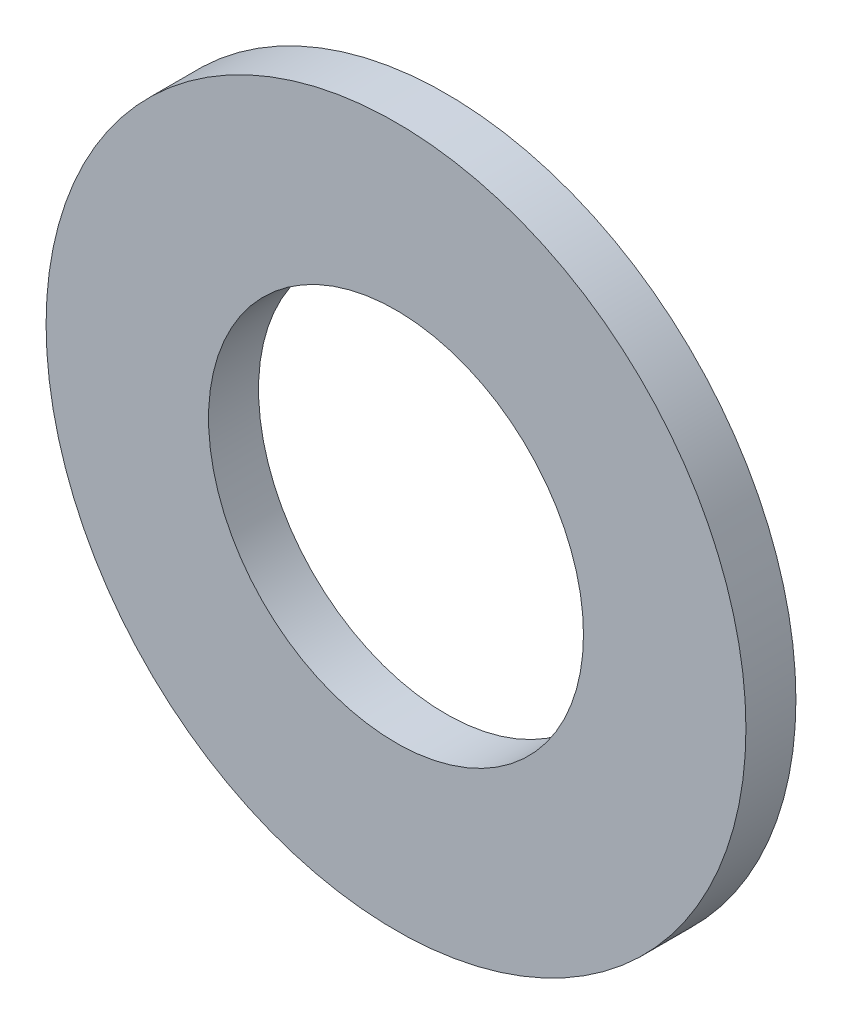
ISO-10303-21;
HEADER;
FILE_DESCRIPTION(('STEP AP214'),'2;1');
FILE_NAME('part.step','',(''),(''),'','','');
FILE_SCHEMA(('AUTOMOTIVE_DESIGN { 1 0 10303 214 1 1 1 1 }'));
ENDSEC;
DATA;
#1=APPLICATION_CONTEXT('core data for automotive mechanical design processes');
#2=APPLICATION_PROTOCOL_DEFINITION('international standard','automotive_design',2000,#1);
#3=PRODUCT_CONTEXT('',#1,'mechanical');
#4=PRODUCT('Part','Part','',(#3));
#5=PRODUCT_RELATED_PRODUCT_CATEGORY('part','',(#4));
#6=PRODUCT_DEFINITION_FORMATION('','',#4);
#7=PRODUCT_DEFINITION_CONTEXT('part definition',#1,'design');
#8=PRODUCT_DEFINITION('design','',#6,#7);
#9=PRODUCT_DEFINITION_SHAPE('','',#8);
#10=(LENGTH_UNIT() NAMED_UNIT(*) SI_UNIT(.MILLI.,.METRE.));
#11=(NAMED_UNIT(*) PLANE_ANGLE_UNIT() SI_UNIT($,.RADIAN.));
#12=(NAMED_UNIT(*) SI_UNIT($,.STERADIAN.) SOLID_ANGLE_UNIT());
#13=UNCERTAINTY_MEASURE_WITH_UNIT(LENGTH_MEASURE(1.E-05),#10,'distance_accuracy_value','');
#14=(GEOMETRIC_REPRESENTATION_CONTEXT(3) GLOBAL_UNCERTAINTY_ASSIGNED_CONTEXT((#13)) GLOBAL_UNIT_ASSIGNED_CONTEXT((#10,
#11,#12)) REPRESENTATION_CONTEXT('',''));
#15=CARTESIAN_POINT('',(0.,0.,0.));
#16=DIRECTION('',(0.,0.,1.));
#17=DIRECTION('',(1.,0.,0.));
#18=AXIS2_PLACEMENT_3D('',#15,#16,#17);
#19=CARTESIAN_POINT('',(0.,0.,2.));
#20=DIRECTION('',(0.,0.,1.));
#21=DIRECTION('',(1.,0.,0.));
#22=AXIS2_PLACEMENT_3D('',#19,#20,#21);
#23=PLANE('',#22);
#24=CARTESIAN_POINT('',(0.,0.,2.));
#25=DIRECTION('',(0.,0.,1.));
#26=DIRECTION('',(1.,0.,0.));
#27=AXIS2_PLACEMENT_3D('',#24,#25,#26);
#28=CIRCLE('',#27,14.);
#29=CARTESIAN_POINT('',(14.,0.,2.));
#30=VERTEX_POINT('',#29);
#31=EDGE_CURVE('E10',#30,#30,#28,.T.);
#32=ORIENTED_EDGE('',*,*,#31,.T.);
#33=EDGE_LOOP('',(#32));
#34=FACE_BOUND('',#33,.T.);
#35=CARTESIAN_POINT('',(0.,0.,2.));
#36=DIRECTION('',(0.,0.,1.));
#37=DIRECTION('',(1.,0.,0.));
#38=AXIS2_PLACEMENT_3D('',#35,#36,#37);
#39=CIRCLE('',#38,7.5);
#40=CARTESIAN_POINT('',(7.5,0.,2.));
#41=VERTEX_POINT('',#40);
#42=EDGE_CURVE('E42',#41,#41,#39,.T.);
#43=ORIENTED_EDGE('',*,*,#42,.F.);
#44=EDGE_LOOP('',(#43));
#45=FACE_BOUND('',#44,.T.);
#46=ADVANCED_FACE('F31',(#34,#45),#23,.T.);
#47=CARTESIAN_POINT('',(0.,0.,0.));
#48=DIRECTION('',(0.,0.,1.));
#49=DIRECTION('',(1.,0.,0.));
#50=AXIS2_PLACEMENT_3D('',#47,#48,#49);
#51=PLANE('',#50);
#52=CARTESIAN_POINT('',(0.,0.,0.));
#53=DIRECTION('',(0.,0.,1.));
#54=DIRECTION('',(1.,0.,0.));
#55=AXIS2_PLACEMENT_3D('',#52,#53,#54);
#56=CIRCLE('',#55,14.);
#57=CARTESIAN_POINT('',(14.,0.,0.));
#58=VERTEX_POINT('',#57);
#59=EDGE_CURVE('E35',#58,#58,#56,.T.);
#60=ORIENTED_EDGE('',*,*,#59,.F.);
#61=EDGE_LOOP('',(#60));
#62=FACE_BOUND('',#61,.T.);
#63=CARTESIAN_POINT('',(0.,0.,0.));
#64=DIRECTION('',(0.,0.,1.));
#65=DIRECTION('',(1.,0.,0.));
#66=AXIS2_PLACEMENT_3D('',#63,#64,#65);
#67=CIRCLE('',#66,7.5);
#68=CARTESIAN_POINT('',(7.5,0.,0.));
#69=VERTEX_POINT('',#68);
#70=EDGE_CURVE('E44',#69,#69,#67,.T.);
#71=ORIENTED_EDGE('',*,*,#70,.T.);
#72=EDGE_LOOP('',(#71));
#73=FACE_BOUND('',#72,.T.);
#74=ADVANCED_FACE('F54',(#62,#73),#51,.F.);
#75=CARTESIAN_POINT('',(0.,0.,2.));
#76=DIRECTION('',(0.,0.,-1.));
#77=DIRECTION('',(-1.,0.,0.));
#78=AXIS2_PLACEMENT_3D('',#75,#76,#77);
#79=CYLINDRICAL_SURFACE('',#78,14.);
#80=ORIENTED_EDGE('',*,*,#31,.F.);
#81=EDGE_LOOP('',(#80));
#82=FACE_BOUND('',#81,.T.);
#83=ORIENTED_EDGE('',*,*,#59,.T.);
#84=EDGE_LOOP('',(#83));
#85=FACE_BOUND('',#84,.T.);
#86=ADVANCED_FACE('F33',(#82,#85),#79,.T.);
#87=CARTESIAN_POINT('',(0.,0.,2.));
#88=DIRECTION('',(0.,0.,-1.));
#89=DIRECTION('',(-1.,0.,0.));
#90=AXIS2_PLACEMENT_3D('',#87,#88,#89);
#91=CYLINDRICAL_SURFACE('',#90,7.5);
#92=ORIENTED_EDGE('',*,*,#42,.T.);
#93=EDGE_LOOP('',(#92));
#94=FACE_BOUND('',#93,.T.);
#95=ORIENTED_EDGE('',*,*,#70,.F.);
#96=EDGE_LOOP('',(#95));
#97=FACE_BOUND('',#96,.T.);
#98=ADVANCED_FACE('F50',(#94,#97),#91,.F.);
#99=CLOSED_SHELL('',(#46,#74,#86,#98));
#100=MANIFOLD_SOLID_BREP('B2',#99);
#101=ADVANCED_BREP_SHAPE_REPRESENTATION('',(#18,#100),#14);
#102=SHAPE_DEFINITION_REPRESENTATION(#9,#101);
ENDSEC;
END-ISO-10303-21;
